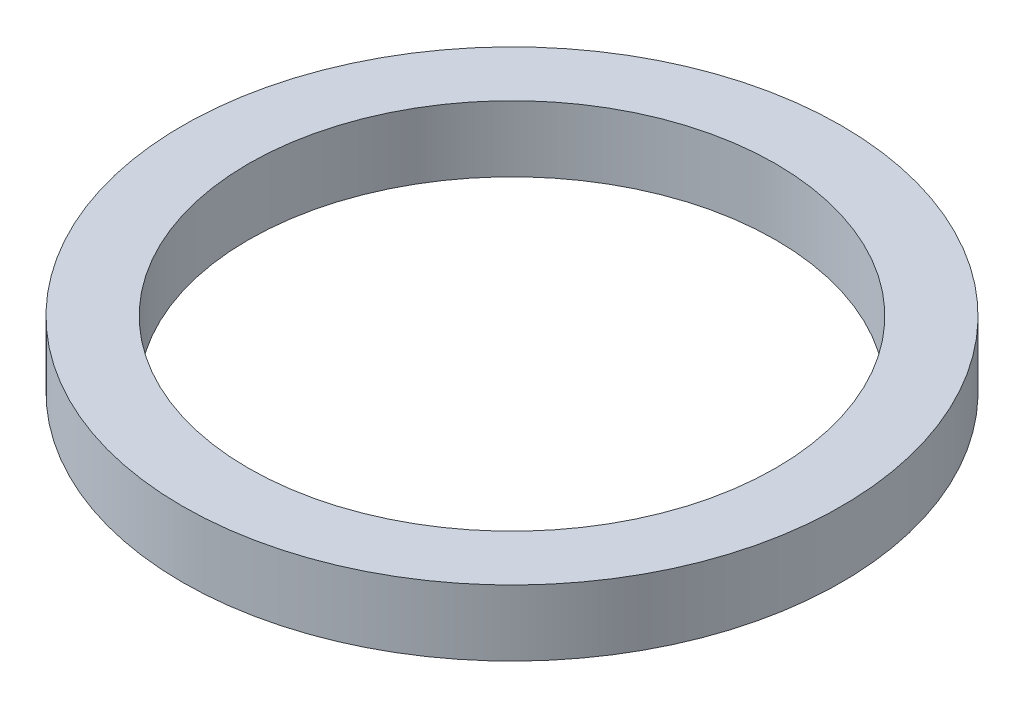
ISO-10303-21;
HEADER;
FILE_DESCRIPTION(('STEP AP214'),'2;1');
FILE_NAME('part.step','',(''),(''),'','','');
FILE_SCHEMA(('AUTOMOTIVE_DESIGN { 1 0 10303 214 1 1 1 1 }'));
ENDSEC;
DATA;
#1=APPLICATION_CONTEXT('core data for automotive mechanical design processes');
#2=APPLICATION_PROTOCOL_DEFINITION('international standard','automotive_design',2000,#1);
#3=PRODUCT_CONTEXT('',#1,'mechanical');
#4=PRODUCT('Part','Part','',(#3));
#5=PRODUCT_RELATED_PRODUCT_CATEGORY('part','',(#4));
#6=PRODUCT_DEFINITION_FORMATION('','',#4);
#7=PRODUCT_DEFINITION_CONTEXT('part definition',#1,'design');
#8=PRODUCT_DEFINITION('design','',#6,#7);
#9=PRODUCT_DEFINITION_SHAPE('','',#8);
#10=(LENGTH_UNIT() NAMED_UNIT(*) SI_UNIT(.MILLI.,.METRE.));
#11=(NAMED_UNIT(*) PLANE_ANGLE_UNIT() SI_UNIT($,.RADIAN.));
#12=(NAMED_UNIT(*) SI_UNIT($,.STERADIAN.) SOLID_ANGLE_UNIT());
#13=UNCERTAINTY_MEASURE_WITH_UNIT(LENGTH_MEASURE(1.E-05),#10,'distance_accuracy_value','');
#14=(GEOMETRIC_REPRESENTATION_CONTEXT(3) GLOBAL_UNCERTAINTY_ASSIGNED_CONTEXT((#13)) GLOBAL_UNIT_ASSIGNED_CONTEXT((#10,
#11,#12)) REPRESENTATION_CONTEXT('',''));
#15=CARTESIAN_POINT('',(0.,0.,0.));
#16=DIRECTION('',(0.,0.,1.));
#17=DIRECTION('',(1.,0.,0.));
#18=AXIS2_PLACEMENT_3D('',#15,#16,#17);
#19=CARTESIAN_POINT('',(0.,1.,0.));
#20=DIRECTION('',(0.,1.,0.));
#21=DIRECTION('',(0.,0.,1.));
#22=AXIS2_PLACEMENT_3D('',#19,#20,#21);
#23=PLANE('',#22);
#24=CARTESIAN_POINT('',(0.,1.,0.));
#25=DIRECTION('',(0.,1.,0.));
#26=DIRECTION('',(0.,0.,1.));
#27=AXIS2_PLACEMENT_3D('',#24,#25,#26);
#28=CIRCLE('',#27,5.);
#29=CARTESIAN_POINT('',(0.,1.,5.));
#30=VERTEX_POINT('',#29);
#31=EDGE_CURVE('E10',#30,#30,#28,.T.);
#32=ORIENTED_EDGE('',*,*,#31,.T.);
#33=EDGE_LOOP('',(#32));
#34=FACE_BOUND('',#33,.T.);
#35=CARTESIAN_POINT('',(0.,1.,0.));
#36=DIRECTION('',(0.,1.,0.));
#37=DIRECTION('',(0.,0.,1.));
#38=AXIS2_PLACEMENT_3D('',#35,#36,#37);
#39=CIRCLE('',#38,4.);
#40=CARTESIAN_POINT('',(0.,1.,4.));
#41=VERTEX_POINT('',#40);
#42=EDGE_CURVE('E54',#41,#41,#39,.T.);
#43=ORIENTED_EDGE('',*,*,#42,.F.);
#44=EDGE_LOOP('',(#43));
#45=FACE_BOUND('',#44,.T.);
#46=ADVANCED_FACE('F41',(#34,#45),#23,.T.);
#47=CARTESIAN_POINT('',(0.,0.,0.));
#48=DIRECTION('',(0.,1.,0.));
#49=DIRECTION('',(0.,0.,1.));
#50=AXIS2_PLACEMENT_3D('',#47,#48,#49);
#51=PLANE('',#50);
#52=CARTESIAN_POINT('',(0.,0.,0.));
#53=DIRECTION('',(0.,1.,0.));
#54=DIRECTION('',(0.,0.,1.));
#55=AXIS2_PLACEMENT_3D('',#52,#53,#54);
#56=CIRCLE('',#55,5.);
#57=CARTESIAN_POINT('',(0.,0.,5.));
#58=VERTEX_POINT('',#57);
#59=EDGE_CURVE('E45',#58,#58,#56,.T.);
#60=ORIENTED_EDGE('',*,*,#59,.F.);
#61=EDGE_LOOP('',(#60));
#62=FACE_BOUND('',#61,.T.);
#63=CARTESIAN_POINT('',(0.,0.,0.));
#64=DIRECTION('',(0.,1.,0.));
#65=DIRECTION('',(0.,0.,1.));
#66=AXIS2_PLACEMENT_3D('',#63,#64,#65);
#67=CIRCLE('',#66,4.);
#68=CARTESIAN_POINT('',(0.,0.,4.));
#69=VERTEX_POINT('',#68);
#70=EDGE_CURVE('E56',#69,#69,#67,.T.);
#71=ORIENTED_EDGE('',*,*,#70,.T.);
#72=EDGE_LOOP('',(#71));
#73=FACE_BOUND('',#72,.T.);
#74=ADVANCED_FACE('F68',(#62,#73),#51,.F.);
#75=CARTESIAN_POINT('',(0.,1.,0.));
#76=DIRECTION('',(0.,-1.,0.));
#77=DIRECTION('',(0.,0.,-1.));
#78=AXIS2_PLACEMENT_3D('',#75,#76,#77);
#79=CYLINDRICAL_SURFACE('',#78,5.);
#80=ORIENTED_EDGE('',*,*,#31,.F.);
#81=EDGE_LOOP('',(#80));
#82=FACE_BOUND('',#81,.T.);
#83=ORIENTED_EDGE('',*,*,#59,.T.);
#84=EDGE_LOOP('',(#83));
#85=FACE_BOUND('',#84,.T.);
#86=ADVANCED_FACE('F43',(#82,#85),#79,.T.);
#87=CARTESIAN_POINT('',(0.,1.,0.));
#88=DIRECTION('',(0.,-1.,0.));
#89=DIRECTION('',(0.,0.,-1.));
#90=AXIS2_PLACEMENT_3D('',#87,#88,#89);
#91=CYLINDRICAL_SURFACE('',#90,4.);
#92=ORIENTED_EDGE('',*,*,#42,.T.);
#93=EDGE_LOOP('',(#92));
#94=FACE_BOUND('',#93,.T.);
#95=ORIENTED_EDGE('',*,*,#70,.F.);
#96=EDGE_LOOP('',(#95));
#97=FACE_BOUND('',#96,.T.);
#98=ADVANCED_FACE('F64',(#94,#97),#91,.F.);
#99=CLOSED_SHELL('',(#46,#74,#86,#98));
#100=MANIFOLD_SOLID_BREP('B2',#99);
#101=ADVANCED_BREP_SHAPE_REPRESENTATION('',(#18,#100),#14);
#102=SHAPE_DEFINITION_REPRESENTATION(#9,#101);
ENDSEC;
END-ISO-10303-21;
